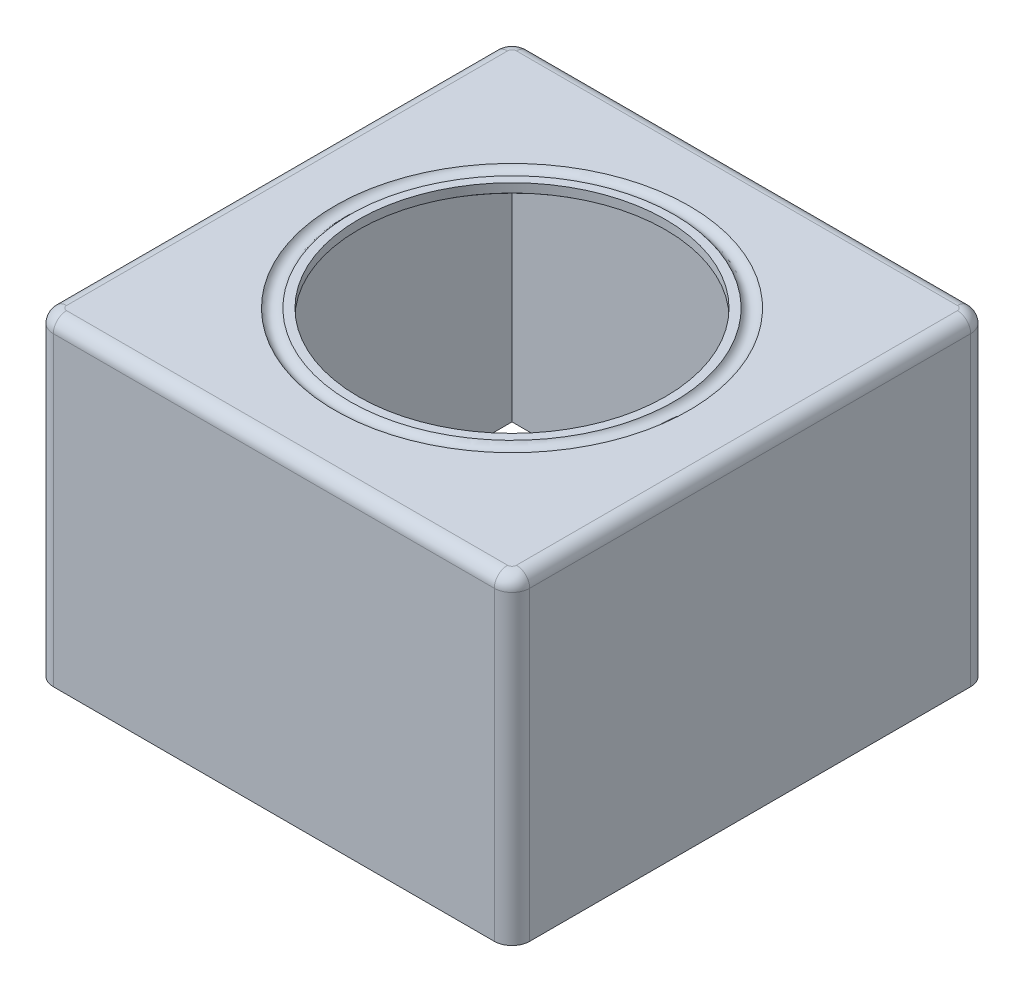
ISO-10303-21;
HEADER;
FILE_DESCRIPTION(('STEP AP214'),'2;1');
FILE_NAME('part.step','',(''),(''),'','','');
FILE_SCHEMA(('AUTOMOTIVE_DESIGN { 1 0 10303 214 1 1 1 1 }'));
ENDSEC;
DATA;
#1=APPLICATION_CONTEXT('core data for automotive mechanical design processes');
#2=APPLICATION_PROTOCOL_DEFINITION('international standard','automotive_design',2000,#1);
#3=PRODUCT_CONTEXT('',#1,'mechanical');
#4=PRODUCT('Part','Part','',(#3));
#5=PRODUCT_RELATED_PRODUCT_CATEGORY('part','',(#4));
#6=PRODUCT_DEFINITION_FORMATION('','',#4);
#7=PRODUCT_DEFINITION_CONTEXT('part definition',#1,'design');
#8=PRODUCT_DEFINITION('design','',#6,#7);
#9=PRODUCT_DEFINITION_SHAPE('','',#8);
#10=(LENGTH_UNIT() NAMED_UNIT(*) SI_UNIT(.MILLI.,.METRE.));
#11=(NAMED_UNIT(*) PLANE_ANGLE_UNIT() SI_UNIT($,.RADIAN.));
#12=(NAMED_UNIT(*) SI_UNIT($,.STERADIAN.) SOLID_ANGLE_UNIT());
#13=UNCERTAINTY_MEASURE_WITH_UNIT(LENGTH_MEASURE(1.E-05),#10,'distance_accuracy_value','');
#14=(GEOMETRIC_REPRESENTATION_CONTEXT(3) GLOBAL_UNCERTAINTY_ASSIGNED_CONTEXT((#13)) GLOBAL_UNIT_ASSIGNED_CONTEXT((#10,
#11,#12)) REPRESENTATION_CONTEXT('',''));
#15=CARTESIAN_POINT('',(0.,0.,0.));
#16=DIRECTION('',(0.,0.,1.));
#17=DIRECTION('',(1.,0.,0.));
#18=AXIS2_PLACEMENT_3D('',#15,#16,#17);
#19=CARTESIAN_POINT('',(-49.751932707483,0.,49.751932707483));
#20=DIRECTION('',(0.,-1.,0.));
#21=DIRECTION('',(0.,0.,-1.));
#22=AXIS2_PLACEMENT_3D('',#19,#20,#21);
#23=PLANE('',#22);
#24=CARTESIAN_POINT('',(-49.751932707483,0.,49.751932707483));
#25=DIRECTION('',(0.,1.,0.));
#26=DIRECTION('',(0.,0.,-1.));
#27=AXIS2_PLACEMENT_3D('',#24,#25,#26);
#28=CIRCLE('',#27,4.);
#29=CARTESIAN_POINT('',(-53.751932707483,0.,49.7519327074829));
#30=VERTEX_POINT('',#29);
#31=CARTESIAN_POINT('',(-49.7519327074829,0.,53.751932707483));
#32=VERTEX_POINT('',#31);
#33=EDGE_CURVE('E186',#30,#32,#28,.T.);
#34=ORIENTED_EDGE('',*,*,#33,.F.);
#35=DIRECTION('',(0.,0.,1.));
#36=VECTOR('',#35,1.);
#37=CARTESIAN_POINT('',(-53.751932707483,0.,49.7519327074829));
#38=LINE('',#37,#36);
#39=CARTESIAN_POINT('',(-53.751932707483,0.,-49.7519327074829));
#40=VERTEX_POINT('',#39);
#41=EDGE_CURVE('E221',#40,#30,#38,.T.);
#42=ORIENTED_EDGE('',*,*,#41,.F.);
#43=CARTESIAN_POINT('',(-49.751932707483,0.,-49.751932707483));
#44=DIRECTION('',(0.,1.,0.));
#45=DIRECTION('',(0.,0.,-1.));
#46=AXIS2_PLACEMENT_3D('',#43,#44,#45);
#47=CIRCLE('',#46,4.);
#48=CARTESIAN_POINT('',(-49.7519327074829,0.,-53.751932707483));
#49=VERTEX_POINT('',#48);
#50=EDGE_CURVE('E217',#49,#40,#47,.T.);
#51=ORIENTED_EDGE('',*,*,#50,.F.);
#52=DIRECTION('',(-1.,0.,0.));
#53=VECTOR('',#52,1.);
#54=CARTESIAN_POINT('',(-49.7519327074829,0.,-53.751932707483));
#55=LINE('',#54,#53);
#56=CARTESIAN_POINT('',(49.7519327074829,0.,-53.751932707483));
#57=VERTEX_POINT('',#56);
#58=EDGE_CURVE('E213',#57,#49,#55,.T.);
#59=ORIENTED_EDGE('',*,*,#58,.F.);
#60=CARTESIAN_POINT('',(49.751932707483,0.,-49.751932707483));
#61=DIRECTION('',(0.,1.,0.));
#62=DIRECTION('',(0.,0.,-1.));
#63=AXIS2_PLACEMENT_3D('',#60,#61,#62);
#64=CIRCLE('',#63,4.);
#65=CARTESIAN_POINT('',(53.751932707483,0.,-49.7519327074829));
#66=VERTEX_POINT('',#65);
#67=EDGE_CURVE('E209',#66,#57,#64,.T.);
#68=ORIENTED_EDGE('',*,*,#67,.F.);
#69=DIRECTION('',(0.,0.,-1.));
#70=VECTOR('',#69,1.);
#71=CARTESIAN_POINT('',(53.751932707483,0.,49.7519327074829));
#72=LINE('',#71,#70);
#73=CARTESIAN_POINT('',(53.751932707483,0.,49.7519327074829));
#74=VERTEX_POINT('',#73);
#75=EDGE_CURVE('E205',#74,#66,#72,.T.);
#76=ORIENTED_EDGE('',*,*,#75,.F.);
#77=CARTESIAN_POINT('',(49.751932707483,0.,49.751932707483));
#78=DIRECTION('',(0.,1.,0.));
#79=DIRECTION('',(0.,0.,1.));
#80=AXIS2_PLACEMENT_3D('',#77,#78,#79);
#81=CIRCLE('',#80,4.);
#82=CARTESIAN_POINT('',(49.7519327074829,0.,53.751932707483));
#83=VERTEX_POINT('',#82);
#84=EDGE_CURVE('E201',#83,#74,#81,.T.);
#85=ORIENTED_EDGE('',*,*,#84,.F.);
#86=DIRECTION('',(1.,0.,0.));
#87=VECTOR('',#86,1.);
#88=CARTESIAN_POINT('',(-49.7519327074829,0.,53.751932707483));
#89=LINE('',#88,#87);
#90=EDGE_CURVE('E192',#32,#83,#89,.T.);
#91=ORIENTED_EDGE('',*,*,#90,.F.);
#92=EDGE_LOOP('',(#34,#42,#51,#59,#68,#76,#85,#91));
#93=FACE_BOUND('',#92,.T.);
#94=DIRECTION('',(-1.,0.,0.));
#95=VECTOR('',#94,1.);
#96=CARTESIAN_POINT('',(-49.751932707483,0.,-49.751932707483));
#97=LINE('',#96,#95);
#98=CARTESIAN_POINT('',(49.751932707483,0.,-49.751932707483));
#99=VERTEX_POINT('',#98);
#100=CARTESIAN_POINT('',(-49.751932707483,0.,-49.751932707483));
#101=VERTEX_POINT('',#100);
#102=EDGE_CURVE('E180',#99,#101,#97,.T.);
#103=ORIENTED_EDGE('',*,*,#102,.T.);
#104=DIRECTION('',(0.,0.,1.));
#105=VECTOR('',#104,1.);
#106=CARTESIAN_POINT('',(-49.751932707483,0.,49.751932707483));
#107=LINE('',#106,#105);
#108=CARTESIAN_POINT('',(-49.751932707483,0.,49.751932707483));
#109=VERTEX_POINT('',#108);
#110=EDGE_CURVE('E325',#101,#109,#107,.T.);
#111=ORIENTED_EDGE('',*,*,#110,.T.);
#112=DIRECTION('',(1.,0.,0.));
#113=VECTOR('',#112,1.);
#114=CARTESIAN_POINT('',(-49.751932707483,0.,49.751932707483));
#115=LINE('',#114,#113);
#116=CARTESIAN_POINT('',(49.751932707483,0.,49.751932707483));
#117=VERTEX_POINT('',#116);
#118=EDGE_CURVE('E184',#109,#117,#115,.T.);
#119=ORIENTED_EDGE('',*,*,#118,.T.);
#120=DIRECTION('',(0.,0.,-1.));
#121=VECTOR('',#120,1.);
#122=CARTESIAN_POINT('',(49.751932707483,0.,49.751932707483));
#123=LINE('',#122,#121);
#124=EDGE_CURVE('E335',#117,#99,#123,.T.);
#125=ORIENTED_EDGE('',*,*,#124,.T.);
#126=EDGE_LOOP('',(#103,#111,#119,#125));
#127=FACE_BOUND('',#126,.T.);
#128=ADVANCED_FACE('F45',(#93,#127),#23,.T.);
#129=CARTESIAN_POINT('',(-49.751932707483,70.,49.751932707483));
#130=DIRECTION('',(0.,-1.,0.));
#131=DIRECTION('',(0.,0.,-1.));
#132=AXIS2_PLACEMENT_3D('',#129,#130,#131);
#133=CYLINDRICAL_SURFACE('',#132,4.);
#134=DIRECTION('',(0.,-1.,0.));
#135=VECTOR('',#134,1.);
#136=CARTESIAN_POINT('',(-49.7519327074829,70.,53.751932707483));
#137=LINE('',#136,#135);
#138=CARTESIAN_POINT('',(-49.7519327074829,69.,53.751932707483));
#139=VERTEX_POINT('',#138);
#140=EDGE_CURVE('E246',#139,#32,#137,.T.);
#141=ORIENTED_EDGE('',*,*,#140,.F.);
#142=CARTESIAN_POINT('',(-49.751932707483,69.,49.751932707483));
#143=DIRECTION('',(0.,1.,0.));
#144=DIRECTION('',(0.,0.,1.));
#145=AXIS2_PLACEMENT_3D('',#142,#143,#144);
#146=CIRCLE('',#145,4.);
#147=CARTESIAN_POINT('',(-53.751932707483,69.,49.7519327074829));
#148=VERTEX_POINT('',#147);
#149=EDGE_CURVE('E281',#139,#148,#146,.F.);
#150=ORIENTED_EDGE('',*,*,#149,.T.);
#151=DIRECTION('',(0.,-1.,0.));
#152=VECTOR('',#151,1.);
#153=CARTESIAN_POINT('',(-53.751932707483,70.,49.7519327074829));
#154=LINE('',#153,#152);
#155=EDGE_CURVE('E225',#148,#30,#154,.T.);
#156=ORIENTED_EDGE('',*,*,#155,.T.);
#157=ORIENTED_EDGE('',*,*,#33,.T.);
#158=EDGE_LOOP('',(#141,#150,#156,#157));
#159=FACE_BOUND('',#158,.T.);
#160=ADVANCED_FACE('F356',(#159),#133,.T.);
#161=CARTESIAN_POINT('',(-49.7519327074829,70.,53.751932707483));
#162=DIRECTION('',(0.,0.,-1.));
#163=DIRECTION('',(-1.,0.,0.));
#164=AXIS2_PLACEMENT_3D('',#161,#162,#163);
#165=PLANE('',#164);
#166=DIRECTION('',(0.,-1.,0.));
#167=VECTOR('',#166,1.);
#168=CARTESIAN_POINT('',(49.7519327074829,70.,53.751932707483));
#169=LINE('',#168,#167);
#170=CARTESIAN_POINT('',(49.7519327074829,69.,53.751932707483));
#171=VERTEX_POINT('',#170);
#172=EDGE_CURVE('E243',#171,#83,#169,.T.);
#173=ORIENTED_EDGE('',*,*,#172,.F.);
#174=DIRECTION('',(1.,0.,0.));
#175=VECTOR('',#174,1.);
#176=CARTESIAN_POINT('',(-49.7519327074829,69.,53.751932707483));
#177=LINE('',#176,#175);
#178=EDGE_CURVE('E278',#171,#139,#177,.F.);
#179=ORIENTED_EDGE('',*,*,#178,.T.);
#180=ORIENTED_EDGE('',*,*,#140,.T.);
#181=ORIENTED_EDGE('',*,*,#90,.T.);
#182=EDGE_LOOP('',(#173,#179,#180,#181));
#183=FACE_BOUND('',#182,.T.);
#184=ADVANCED_FACE('F362',(#183),#165,.F.);
#185=CARTESIAN_POINT('',(49.751932707483,70.,49.751932707483));
#186=DIRECTION('',(0.,-1.,0.));
#187=DIRECTION('',(0.,0.,-1.));
#188=AXIS2_PLACEMENT_3D('',#185,#186,#187);
#189=CYLINDRICAL_SURFACE('',#188,4.);
#190=DIRECTION('',(0.,-1.,0.));
#191=VECTOR('',#190,1.);
#192=CARTESIAN_POINT('',(53.751932707483,70.,49.7519327074829));
#193=LINE('',#192,#191);
#194=CARTESIAN_POINT('',(53.751932707483,69.,49.7519327074829));
#195=VERTEX_POINT('',#194);
#196=EDGE_CURVE('E240',#195,#74,#193,.T.);
#197=ORIENTED_EDGE('',*,*,#196,.F.);
#198=CARTESIAN_POINT('',(49.751932707483,69.,49.751932707483));
#199=DIRECTION('',(0.,1.,0.));
#200=DIRECTION('',(0.,0.,1.));
#201=AXIS2_PLACEMENT_3D('',#198,#199,#200);
#202=CIRCLE('',#201,4.);
#203=EDGE_CURVE('E274',#195,#171,#202,.F.);
#204=ORIENTED_EDGE('',*,*,#203,.T.);
#205=ORIENTED_EDGE('',*,*,#172,.T.);
#206=ORIENTED_EDGE('',*,*,#84,.T.);
#207=EDGE_LOOP('',(#197,#204,#205,#206));
#208=FACE_BOUND('',#207,.T.);
#209=ADVANCED_FACE('F386',(#208),#189,.T.);
#210=CARTESIAN_POINT('',(53.751932707483,70.,49.7519327074829));
#211=DIRECTION('',(-1.,0.,0.));
#212=DIRECTION('',(0.,0.,1.));
#213=AXIS2_PLACEMENT_3D('',#210,#211,#212);
#214=PLANE('',#213);
#215=DIRECTION('',(0.,-1.,0.));
#216=VECTOR('',#215,1.);
#217=CARTESIAN_POINT('',(53.751932707483,70.,-49.7519327074829));
#218=LINE('',#217,#216);
#219=CARTESIAN_POINT('',(53.751932707483,69.,-49.7519327074829));
#220=VERTEX_POINT('',#219);
#221=EDGE_CURVE('E237',#220,#66,#218,.T.);
#222=ORIENTED_EDGE('',*,*,#221,.F.);
#223=DIRECTION('',(0.,0.,-1.));
#224=VECTOR('',#223,1.);
#225=CARTESIAN_POINT('',(53.751932707483,69.,49.7519327074829));
#226=LINE('',#225,#224);
#227=EDGE_CURVE('E54',#220,#195,#226,.F.);
#228=ORIENTED_EDGE('',*,*,#227,.T.);
#229=ORIENTED_EDGE('',*,*,#196,.T.);
#230=ORIENTED_EDGE('',*,*,#75,.T.);
#231=EDGE_LOOP('',(#222,#228,#229,#230));
#232=FACE_BOUND('',#231,.T.);
#233=ADVANCED_FACE('F383',(#232),#214,.F.);
#234=CARTESIAN_POINT('',(49.751932707483,70.,-49.751932707483));
#235=DIRECTION('',(0.,-1.,0.));
#236=DIRECTION('',(0.,0.,-1.));
#237=AXIS2_PLACEMENT_3D('',#234,#235,#236);
#238=CYLINDRICAL_SURFACE('',#237,4.);
#239=DIRECTION('',(0.,-1.,0.));
#240=VECTOR('',#239,1.);
#241=CARTESIAN_POINT('',(49.7519327074829,70.,-53.751932707483));
#242=LINE('',#241,#240);
#243=CARTESIAN_POINT('',(49.7519327074829,69.,-53.751932707483));
#244=VERTEX_POINT('',#243);
#245=EDGE_CURVE('E234',#244,#57,#242,.T.);
#246=ORIENTED_EDGE('',*,*,#245,.F.);
#247=CARTESIAN_POINT('',(49.751932707483,69.,-49.751932707483));
#248=DIRECTION('',(0.,1.,0.));
#249=DIRECTION('',(0.,0.,1.));
#250=AXIS2_PLACEMENT_3D('',#247,#248,#249);
#251=CIRCLE('',#250,4.);
#252=EDGE_CURVE('E61',#244,#220,#251,.F.);
#253=ORIENTED_EDGE('',*,*,#252,.T.);
#254=ORIENTED_EDGE('',*,*,#221,.T.);
#255=ORIENTED_EDGE('',*,*,#67,.T.);
#256=EDGE_LOOP('',(#246,#253,#254,#255));
#257=FACE_BOUND('',#256,.T.);
#258=ADVANCED_FACE('F380',(#257),#238,.T.);
#259=CARTESIAN_POINT('',(-49.7519327074829,70.,-53.751932707483));
#260=DIRECTION('',(0.,0.,1.));
#261=DIRECTION('',(1.,0.,0.));
#262=AXIS2_PLACEMENT_3D('',#259,#260,#261);
#263=PLANE('',#262);
#264=DIRECTION('',(0.,-1.,0.));
#265=VECTOR('',#264,1.);
#266=CARTESIAN_POINT('',(-49.7519327074829,70.,-53.751932707483));
#267=LINE('',#266,#265);
#268=CARTESIAN_POINT('',(-49.7519327074829,69.,-53.751932707483));
#269=VERTEX_POINT('',#268);
#270=EDGE_CURVE('E231',#269,#49,#267,.T.);
#271=ORIENTED_EDGE('',*,*,#270,.F.);
#272=DIRECTION('',(-1.,0.,0.));
#273=VECTOR('',#272,1.);
#274=CARTESIAN_POINT('',(49.7519327074829,69.,-53.751932707483));
#275=LINE('',#274,#273);
#276=EDGE_CURVE('E69',#269,#244,#275,.F.);
#277=ORIENTED_EDGE('',*,*,#276,.T.);
#278=ORIENTED_EDGE('',*,*,#245,.T.);
#279=ORIENTED_EDGE('',*,*,#58,.T.);
#280=EDGE_LOOP('',(#271,#277,#278,#279));
#281=FACE_BOUND('',#280,.T.);
#282=ADVANCED_FACE('F376',(#281),#263,.F.);
#283=CARTESIAN_POINT('',(-49.751932707483,70.,-49.751932707483));
#284=DIRECTION('',(0.,-1.,0.));
#285=DIRECTION('',(0.,0.,-1.));
#286=AXIS2_PLACEMENT_3D('',#283,#284,#285);
#287=CYLINDRICAL_SURFACE('',#286,4.);
#288=DIRECTION('',(0.,-1.,0.));
#289=VECTOR('',#288,1.);
#290=CARTESIAN_POINT('',(-53.751932707483,70.,-49.7519327074829));
#291=LINE('',#290,#289);
#292=CARTESIAN_POINT('',(-53.751932707483,69.,-49.7519327074829));
#293=VERTEX_POINT('',#292);
#294=EDGE_CURVE('E228',#293,#40,#291,.T.);
#295=ORIENTED_EDGE('',*,*,#294,.F.);
#296=CARTESIAN_POINT('',(-49.751932707483,69.,-49.751932707483));
#297=DIRECTION('',(0.,1.,0.));
#298=DIRECTION('',(0.,0.,1.));
#299=AXIS2_PLACEMENT_3D('',#296,#297,#298);
#300=CIRCLE('',#299,4.);
#301=EDGE_CURVE('E287',#293,#269,#300,.F.);
#302=ORIENTED_EDGE('',*,*,#301,.T.);
#303=ORIENTED_EDGE('',*,*,#270,.T.);
#304=ORIENTED_EDGE('',*,*,#50,.T.);
#305=EDGE_LOOP('',(#295,#302,#303,#304));
#306=FACE_BOUND('',#305,.T.);
#307=ADVANCED_FACE('F372',(#306),#287,.T.);
#308=CARTESIAN_POINT('',(-53.751932707483,70.,49.7519327074829));
#309=DIRECTION('',(1.,0.,0.));
#310=DIRECTION('',(0.,0.,-1.));
#311=AXIS2_PLACEMENT_3D('',#308,#309,#310);
#312=PLANE('',#311);
#313=ORIENTED_EDGE('',*,*,#155,.F.);
#314=DIRECTION('',(0.,0.,1.));
#315=VECTOR('',#314,1.);
#316=CARTESIAN_POINT('',(-53.751932707483,69.,-49.7519327074829));
#317=LINE('',#316,#315);
#318=EDGE_CURVE('E284',#148,#293,#317,.F.);
#319=ORIENTED_EDGE('',*,*,#318,.T.);
#320=ORIENTED_EDGE('',*,*,#294,.T.);
#321=ORIENTED_EDGE('',*,*,#41,.T.);
#322=EDGE_LOOP('',(#313,#319,#320,#321));
#323=FACE_BOUND('',#322,.T.);
#324=ADVANCED_FACE('F369',(#323),#312,.F.);
#325=CARTESIAN_POINT('',(-49.751932707483,70.,49.751932707483));
#326=DIRECTION('',(1.,0.,0.));
#327=DIRECTION('',(0.,0.,-1.));
#328=AXIS2_PLACEMENT_3D('',#325,#326,#327);
#329=PLANE('',#328);
#330=ORIENTED_EDGE('',*,*,#110,.F.);
#331=DIRECTION('',(0.,-1.,0.));
#332=VECTOR('',#331,1.);
#333=CARTESIAN_POINT('',(-49.751932707483,70.,-49.751932707483));
#334=LINE('',#333,#332);
#335=CARTESIAN_POINT('',(-49.751932707483,70.,-49.751932707483));
#336=VERTEX_POINT('',#335);
#337=EDGE_CURVE('E178',#336,#101,#334,.T.);
#338=ORIENTED_EDGE('',*,*,#337,.F.);
#339=DIRECTION('',(0.,0.,1.));
#340=VECTOR('',#339,1.);
#341=CARTESIAN_POINT('',(-49.751932707483,70.,49.751932707483));
#342=LINE('',#341,#340);
#343=CARTESIAN_POINT('',(-49.751932707483,70.,49.751932707483));
#344=VERTEX_POINT('',#343);
#345=EDGE_CURVE('E162',#336,#344,#342,.T.);
#346=ORIENTED_EDGE('',*,*,#345,.T.);
#347=DIRECTION('',(0.,-1.,0.));
#348=VECTOR('',#347,1.);
#349=CARTESIAN_POINT('',(-49.751932707483,70.,49.751932707483));
#350=LINE('',#349,#348);
#351=EDGE_CURVE('E175',#344,#109,#350,.T.);
#352=ORIENTED_EDGE('',*,*,#351,.T.);
#353=EDGE_LOOP('',(#330,#338,#346,#352));
#354=FACE_BOUND('',#353,.T.);
#355=ADVANCED_FACE('F174',(#354),#329,.T.);
#356=CARTESIAN_POINT('',(-49.751932707483,70.,49.751932707483));
#357=DIRECTION('',(0.,0.,-1.));
#358=DIRECTION('',(-1.,0.,0.));
#359=AXIS2_PLACEMENT_3D('',#356,#357,#358);
#360=PLANE('',#359);
#361=ORIENTED_EDGE('',*,*,#118,.F.);
#362=ORIENTED_EDGE('',*,*,#351,.F.);
#363=DIRECTION('',(1.,0.,0.));
#364=VECTOR('',#363,1.);
#365=CARTESIAN_POINT('',(-49.751932707483,70.,49.751932707483));
#366=LINE('',#365,#364);
#367=CARTESIAN_POINT('',(49.751932707483,70.,49.751932707483));
#368=VERTEX_POINT('',#367);
#369=EDGE_CURVE('E159',#344,#368,#366,.T.);
#370=ORIENTED_EDGE('',*,*,#369,.T.);
#371=DIRECTION('',(0.,-1.,0.));
#372=VECTOR('',#371,1.);
#373=CARTESIAN_POINT('',(49.751932707483,70.,49.751932707483));
#374=LINE('',#373,#372);
#375=EDGE_CURVE('E187',#368,#117,#374,.T.);
#376=ORIENTED_EDGE('',*,*,#375,.T.);
#377=EDGE_LOOP('',(#361,#362,#370,#376));
#378=FACE_BOUND('',#377,.T.);
#379=ADVANCED_FACE('F182',(#378),#360,.T.);
#380=CARTESIAN_POINT('',(49.751932707483,70.,49.751932707483));
#381=DIRECTION('',(-1.,0.,0.));
#382=DIRECTION('',(0.,0.,1.));
#383=AXIS2_PLACEMENT_3D('',#380,#381,#382);
#384=PLANE('',#383);
#385=ORIENTED_EDGE('',*,*,#124,.F.);
#386=ORIENTED_EDGE('',*,*,#375,.F.);
#387=DIRECTION('',(0.,0.,-1.));
#388=VECTOR('',#387,1.);
#389=CARTESIAN_POINT('',(49.751932707483,70.,49.751932707483));
#390=LINE('',#389,#388);
#391=CARTESIAN_POINT('',(49.751932707483,70.,-49.751932707483));
#392=VERTEX_POINT('',#391);
#393=EDGE_CURVE('E165',#368,#392,#390,.T.);
#394=ORIENTED_EDGE('',*,*,#393,.T.);
#395=DIRECTION('',(0.,-1.,0.));
#396=VECTOR('',#395,1.);
#397=CARTESIAN_POINT('',(49.751932707483,70.,-49.751932707483));
#398=LINE('',#397,#396);
#399=EDGE_CURVE('E194',#392,#99,#398,.T.);
#400=ORIENTED_EDGE('',*,*,#399,.T.);
#401=EDGE_LOOP('',(#385,#386,#394,#400));
#402=FACE_BOUND('',#401,.T.);
#403=ADVANCED_FACE('F352',(#402),#384,.T.);
#404=CARTESIAN_POINT('',(-49.751932707483,70.,-49.751932707483));
#405=DIRECTION('',(0.,0.,1.));
#406=DIRECTION('',(1.,0.,0.));
#407=AXIS2_PLACEMENT_3D('',#404,#405,#406);
#408=PLANE('',#407);
#409=ORIENTED_EDGE('',*,*,#102,.F.);
#410=ORIENTED_EDGE('',*,*,#399,.F.);
#411=DIRECTION('',(-1.,0.,0.));
#412=VECTOR('',#411,1.);
#413=CARTESIAN_POINT('',(-49.751932707483,70.,-49.751932707483));
#414=LINE('',#413,#412);
#415=EDGE_CURVE('E338',#392,#336,#414,.T.);
#416=ORIENTED_EDGE('',*,*,#415,.T.);
#417=ORIENTED_EDGE('',*,*,#337,.T.);
#418=EDGE_LOOP('',(#409,#410,#416,#417));
#419=FACE_BOUND('',#418,.T.);
#420=ADVANCED_FACE('F354',(#419),#408,.T.);
#421=CARTESIAN_POINT('',(0.,72.,0.));
#422=DIRECTION('',(0.,1.,0.));
#423=DIRECTION('',(0.,0.,1.));
#424=AXIS2_PLACEMENT_3D('',#421,#422,#423);
#425=PLANE('',#424);
#426=DIRECTION('',(1.,0.,0.));
#427=VECTOR('',#426,1.);
#428=CARTESIAN_POINT('',(49.751932707483,72.,50.751932707483));
#429=LINE('',#428,#427);
#430=CARTESIAN_POINT('',(-49.7519327074829,72.,50.751932707483));
#431=VERTEX_POINT('',#430);
#432=CARTESIAN_POINT('',(49.751932707483,72.,50.751932707483));
#433=VERTEX_POINT('',#432);
#434=EDGE_CURVE('E267',#431,#433,#429,.T.);
#435=ORIENTED_EDGE('',*,*,#434,.T.);
#436=CARTESIAN_POINT('',(49.751932707483,72.,49.751932707483));
#437=DIRECTION('',(0.,1.,0.));
#438=DIRECTION('',(0.,0.,1.));
#439=AXIS2_PLACEMENT_3D('',#436,#437,#438);
#440=CIRCLE('',#439,0.999999999999997);
#441=CARTESIAN_POINT('',(50.751932707483,72.,49.751932707483));
#442=VERTEX_POINT('',#441);
#443=EDGE_CURVE('E270',#433,#442,#440,.T.);
#444=ORIENTED_EDGE('',*,*,#443,.T.);
#445=DIRECTION('',(0.,0.,-1.));
#446=VECTOR('',#445,1.);
#447=CARTESIAN_POINT('',(50.751932707483,72.,-49.7519327074829));
#448=LINE('',#447,#446);
#449=CARTESIAN_POINT('',(50.751932707483,72.,-49.751932707483));
#450=VERTEX_POINT('',#449);
#451=EDGE_CURVE('E249',#442,#450,#448,.T.);
#452=ORIENTED_EDGE('',*,*,#451,.T.);
#453=CARTESIAN_POINT('',(49.751932707483,72.,-49.751932707483));
#454=DIRECTION('',(0.,1.,0.));
#455=DIRECTION('',(0.,0.,1.));
#456=AXIS2_PLACEMENT_3D('',#453,#454,#455);
#457=CIRCLE('',#456,0.999999999999997);
#458=CARTESIAN_POINT('',(49.7519327074829,72.,-50.751932707483));
#459=VERTEX_POINT('',#458);
#460=EDGE_CURVE('E252',#450,#459,#457,.T.);
#461=ORIENTED_EDGE('',*,*,#460,.T.);
#462=DIRECTION('',(-1.,0.,0.));
#463=VECTOR('',#462,1.);
#464=CARTESIAN_POINT('',(-49.7519327074829,72.,-50.751932707483));
#465=LINE('',#464,#463);
#466=CARTESIAN_POINT('',(-49.751932707483,72.,-50.751932707483));
#467=VERTEX_POINT('',#466);
#468=EDGE_CURVE('E255',#459,#467,#465,.T.);
#469=ORIENTED_EDGE('',*,*,#468,.T.);
#470=CARTESIAN_POINT('',(-49.751932707483,72.,-49.751932707483));
#471=DIRECTION('',(0.,1.,0.));
#472=DIRECTION('',(0.,0.,1.));
#473=AXIS2_PLACEMENT_3D('',#470,#471,#472);
#474=CIRCLE('',#473,0.999999999999997);
#475=CARTESIAN_POINT('',(-50.751932707483,72.,-49.7519327074829));
#476=VERTEX_POINT('',#475);
#477=EDGE_CURVE('E258',#467,#476,#474,.T.);
#478=ORIENTED_EDGE('',*,*,#477,.T.);
#479=DIRECTION('',(0.,0.,1.));
#480=VECTOR('',#479,1.);
#481=CARTESIAN_POINT('',(-50.751932707483,72.,49.7519327074829));
#482=LINE('',#481,#480);
#483=CARTESIAN_POINT('',(-50.751932707483,72.,49.751932707483));
#484=VERTEX_POINT('',#483);
#485=EDGE_CURVE('E261',#476,#484,#482,.T.);
#486=ORIENTED_EDGE('',*,*,#485,.T.);
#487=CARTESIAN_POINT('',(-49.751932707483,72.,49.751932707483));
#488=DIRECTION('',(0.,1.,0.));
#489=DIRECTION('',(0.,0.,1.));
#490=AXIS2_PLACEMENT_3D('',#487,#488,#489);
#491=CIRCLE('',#490,0.999999999999997);
#492=EDGE_CURVE('E264',#484,#431,#491,.T.);
#493=ORIENTED_EDGE('',*,*,#492,.T.);
#494=EDGE_LOOP('',(#435,#444,#452,#461,#469,#478,#486,#493));
#495=FACE_BOUND('',#494,.T.);
#496=CARTESIAN_POINT('',(0.,72.,0.));
#497=DIRECTION('',(0.,-1.,0.));
#498=DIRECTION('',(0.,0.,-1.));
#499=AXIS2_PLACEMENT_3D('',#496,#497,#498);
#500=CIRCLE('',#499,39.9779267923513);
#501=CARTESIAN_POINT('',(0.,72.,-39.9779267923513));
#502=VERTEX_POINT('',#501);
#503=EDGE_CURVE('E467',#502,#502,#500,.T.);
#504=ORIENTED_EDGE('',*,*,#503,.T.);
#505=EDGE_LOOP('',(#504));
#506=FACE_BOUND('',#505,.T.);
#507=ADVANCED_FACE('F427',(#495,#506),#425,.T.);
#508=CARTESIAN_POINT('',(0.,70.,0.));
#509=DIRECTION('',(0.,1.,0.));
#510=DIRECTION('',(0.,0.,1.));
#511=AXIS2_PLACEMENT_3D('',#508,#509,#510);
#512=PLANE('',#511);
#513=CARTESIAN_POINT('',(0.,70.,0.));
#514=DIRECTION('',(0.,1.,0.));
#515=DIRECTION('',(0.,0.,1.));
#516=AXIS2_PLACEMENT_3D('',#513,#514,#515);
#517=CIRCLE('',#516,41.9062821272601);
#518=CARTESIAN_POINT('',(0.,70.,41.9062821272601));
#519=VERTEX_POINT('',#518);
#520=EDGE_CURVE('E11',#519,#519,#517,.F.);
#521=ORIENTED_EDGE('',*,*,#520,.F.);
#522=EDGE_LOOP('',(#521));
#523=FACE_BOUND('',#522,.T.);
#524=ORIENTED_EDGE('',*,*,#345,.F.);
#525=ORIENTED_EDGE('',*,*,#415,.F.);
#526=ORIENTED_EDGE('',*,*,#393,.F.);
#527=ORIENTED_EDGE('',*,*,#369,.F.);
#528=EDGE_LOOP('',(#524,#525,#526,#527));
#529=FACE_BOUND('',#528,.T.);
#530=ADVANCED_FACE('F161',(#523,#529),#512,.F.);
#531=CARTESIAN_POINT('',(-49.751932707483,69.,-49.751932707483));
#532=DIRECTION('',(0.,1.,0.));
#533=DIRECTION('',(0.,0.,1.));
#534=AXIS2_PLACEMENT_3D('',#531,#532,#533);
#535=DEGENERATE_TOROIDAL_SURFACE('',#534,0.999999999999997,3.,.T.);
#536=CARTESIAN_POINT('',(-49.751932707483,69.,-50.751932707483));
#537=DIRECTION('',(1.,0.,0.));
#538=DIRECTION('',(0.,0.,-1.));
#539=AXIS2_PLACEMENT_3D('',#536,#537,#538);
#540=CIRCLE('',#539,3.);
#541=EDGE_CURVE('E319',#269,#467,#540,.T.);
#542=ORIENTED_EDGE('',*,*,#541,.F.);
#543=ORIENTED_EDGE('',*,*,#301,.F.);
#544=CARTESIAN_POINT('',(-50.751932707483,69.,-49.7519327074829));
#545=DIRECTION('',(0.,0.,1.));
#546=DIRECTION('',(1.,0.,0.));
#547=AXIS2_PLACEMENT_3D('',#544,#545,#546);
#548=CIRCLE('',#547,3.);
#549=EDGE_CURVE('E322',#476,#293,#548,.T.);
#550=ORIENTED_EDGE('',*,*,#549,.F.);
#551=ORIENTED_EDGE('',*,*,#477,.F.);
#552=EDGE_LOOP('',(#542,#543,#550,#551));
#553=FACE_BOUND('',#552,.T.);
#554=ADVANCED_FACE('F47',(#553),#535,.T.);
#555=CARTESIAN_POINT('',(-50.751932707483,69.,0.));
#556=DIRECTION('',(0.,0.,-1.));
#557=DIRECTION('',(-1.,0.,0.));
#558=AXIS2_PLACEMENT_3D('',#555,#556,#557);
#559=CYLINDRICAL_SURFACE('',#558,3.);
#560=ORIENTED_EDGE('',*,*,#549,.T.);
#561=ORIENTED_EDGE('',*,*,#318,.F.);
#562=CARTESIAN_POINT('',(-50.751932707483,69.,49.751932707483));
#563=DIRECTION('',(0.,0.,1.));
#564=DIRECTION('',(1.,0.,0.));
#565=AXIS2_PLACEMENT_3D('',#562,#563,#564);
#566=CIRCLE('',#565,3.);
#567=EDGE_CURVE('E315',#484,#148,#566,.T.);
#568=ORIENTED_EDGE('',*,*,#567,.F.);
#569=ORIENTED_EDGE('',*,*,#485,.F.);
#570=EDGE_LOOP('',(#560,#561,#568,#569));
#571=FACE_BOUND('',#570,.T.);
#572=ADVANCED_FACE('F417',(#571),#559,.T.);
#573=CARTESIAN_POINT('',(0.,69.,-50.751932707483));
#574=DIRECTION('',(1.,0.,0.));
#575=DIRECTION('',(0.,0.,-1.));
#576=AXIS2_PLACEMENT_3D('',#573,#574,#575);
#577=CYLINDRICAL_SURFACE('',#576,3.);
#578=ORIENTED_EDGE('',*,*,#541,.T.);
#579=ORIENTED_EDGE('',*,*,#468,.F.);
#580=CARTESIAN_POINT('',(49.7519327074829,69.,-50.751932707483));
#581=DIRECTION('',(1.,0.,0.));
#582=DIRECTION('',(0.,0.,-1.));
#583=AXIS2_PLACEMENT_3D('',#580,#581,#582);
#584=CIRCLE('',#583,3.);
#585=EDGE_CURVE('E311',#244,#459,#584,.T.);
#586=ORIENTED_EDGE('',*,*,#585,.F.);
#587=ORIENTED_EDGE('',*,*,#276,.F.);
#588=EDGE_LOOP('',(#578,#579,#586,#587));
#589=FACE_BOUND('',#588,.T.);
#590=ADVANCED_FACE('F414',(#589),#577,.T.);
#591=CARTESIAN_POINT('',(-49.751932707483,69.,49.751932707483));
#592=DIRECTION('',(0.,1.,0.));
#593=DIRECTION('',(0.,0.,1.));
#594=AXIS2_PLACEMENT_3D('',#591,#592,#593);
#595=DEGENERATE_TOROIDAL_SURFACE('',#594,0.999999999999997,3.,.T.);
#596=ORIENTED_EDGE('',*,*,#567,.T.);
#597=ORIENTED_EDGE('',*,*,#149,.F.);
#598=CARTESIAN_POINT('',(-49.7519327074829,69.,50.751932707483));
#599=DIRECTION('',(1.,0.,0.));
#600=DIRECTION('',(0.,0.,-1.));
#601=AXIS2_PLACEMENT_3D('',#598,#599,#600);
#602=CIRCLE('',#601,3.);
#603=EDGE_CURVE('E307',#431,#139,#602,.T.);
#604=ORIENTED_EDGE('',*,*,#603,.F.);
#605=ORIENTED_EDGE('',*,*,#492,.F.);
#606=EDGE_LOOP('',(#596,#597,#604,#605));
#607=FACE_BOUND('',#606,.T.);
#608=ADVANCED_FACE('F410',(#607),#595,.T.);
#609=CARTESIAN_POINT('',(49.751932707483,69.,-49.751932707483));
#610=DIRECTION('',(0.,1.,0.));
#611=DIRECTION('',(0.,0.,1.));
#612=AXIS2_PLACEMENT_3D('',#609,#610,#611);
#613=DEGENERATE_TOROIDAL_SURFACE('',#612,0.999999999999997,3.,.T.);
#614=ORIENTED_EDGE('',*,*,#585,.T.);
#615=ORIENTED_EDGE('',*,*,#460,.F.);
#616=CARTESIAN_POINT('',(50.751932707483,69.,-49.751932707483));
#617=DIRECTION('',(0.,0.,1.));
#618=DIRECTION('',(1.,0.,0.));
#619=AXIS2_PLACEMENT_3D('',#616,#617,#618);
#620=CIRCLE('',#619,3.);
#621=EDGE_CURVE('E303',#220,#450,#620,.T.);
#622=ORIENTED_EDGE('',*,*,#621,.F.);
#623=ORIENTED_EDGE('',*,*,#252,.F.);
#624=EDGE_LOOP('',(#614,#615,#622,#623));
#625=FACE_BOUND('',#624,.T.);
#626=ADVANCED_FACE('F406',(#625),#613,.T.);
#627=CARTESIAN_POINT('',(0.,69.,50.751932707483));
#628=DIRECTION('',(-1.,0.,0.));
#629=DIRECTION('',(0.,0.,1.));
#630=AXIS2_PLACEMENT_3D('',#627,#628,#629);
#631=CYLINDRICAL_SURFACE('',#630,3.);
#632=ORIENTED_EDGE('',*,*,#603,.T.);
#633=ORIENTED_EDGE('',*,*,#178,.F.);
#634=CARTESIAN_POINT('',(49.751932707483,69.,50.751932707483));
#635=DIRECTION('',(1.,0.,0.));
#636=DIRECTION('',(0.,0.,-1.));
#637=AXIS2_PLACEMENT_3D('',#634,#635,#636);
#638=CIRCLE('',#637,3.);
#639=EDGE_CURVE('E299',#433,#171,#638,.T.);
#640=ORIENTED_EDGE('',*,*,#639,.F.);
#641=ORIENTED_EDGE('',*,*,#434,.F.);
#642=EDGE_LOOP('',(#632,#633,#640,#641));
#643=FACE_BOUND('',#642,.T.);
#644=ADVANCED_FACE('F402',(#643),#631,.T.);
#645=CARTESIAN_POINT('',(50.751932707483,69.,0.));
#646=DIRECTION('',(0.,0.,1.));
#647=DIRECTION('',(1.,0.,0.));
#648=AXIS2_PLACEMENT_3D('',#645,#646,#647);
#649=CYLINDRICAL_SURFACE('',#648,3.);
#650=ORIENTED_EDGE('',*,*,#621,.T.);
#651=ORIENTED_EDGE('',*,*,#451,.F.);
#652=CARTESIAN_POINT('',(50.751932707483,69.,49.7519327074829));
#653=DIRECTION('',(0.,0.,1.));
#654=DIRECTION('',(0.,-1.,0.));
#655=AXIS2_PLACEMENT_3D('',#652,#653,#654);
#656=CIRCLE('',#655,3.);
#657=EDGE_CURVE('E296',#195,#442,#656,.T.);
#658=ORIENTED_EDGE('',*,*,#657,.F.);
#659=ORIENTED_EDGE('',*,*,#227,.F.);
#660=EDGE_LOOP('',(#650,#651,#658,#659));
#661=FACE_BOUND('',#660,.T.);
#662=ADVANCED_FACE('F398',(#661),#649,.T.);
#663=CARTESIAN_POINT('',(49.751932707483,69.,49.751932707483));
#664=DIRECTION('',(0.,1.,0.));
#665=DIRECTION('',(0.,0.,1.));
#666=AXIS2_PLACEMENT_3D('',#663,#664,#665);
#667=DEGENERATE_TOROIDAL_SURFACE('',#666,0.999999999999997,3.,.T.);
#668=ORIENTED_EDGE('',*,*,#639,.T.);
#669=ORIENTED_EDGE('',*,*,#203,.F.);
#670=ORIENTED_EDGE('',*,*,#657,.T.);
#671=ORIENTED_EDGE('',*,*,#443,.F.);
#672=EDGE_LOOP('',(#668,#669,#670,#671));
#673=FACE_BOUND('',#672,.T.);
#674=ADVANCED_FACE('F394',(#673),#667,.T.);
#675=CARTESIAN_POINT('',(0.,74.2066457982881,0.));
#676=DIRECTION('',(0.,-1.,0.));
#677=DIRECTION('',(0.,0.,-1.));
#678=AXIS2_PLACEMENT_3D('',#675,#676,#677);
#679=TOROIDAL_SURFACE('',#678,38.2688444694406,5.56118886451257);
#680=CARTESIAN_POINT('',(0.,70.,0.));
#681=DIRECTION('',(0.,-1.,0.));
#682=DIRECTION('',(0.,0.,-1.));
#683=AXIS2_PLACEMENT_3D('',#680,#681,#682);
#684=CIRCLE('',#683,34.631406811621);
#685=CARTESIAN_POINT('',(0.,70.,-34.631406811621));
#686=VERTEX_POINT('',#685);
#687=EDGE_CURVE('E300',#686,#686,#684,.T.);
#688=ORIENTED_EDGE('',*,*,#687,.F.);
#689=EDGE_LOOP('',(#688));
#690=FACE_BOUND('',#689,.T.);
#691=ORIENTED_EDGE('',*,*,#520,.T.);
#692=EDGE_LOOP('',(#691));
#693=FACE_BOUND('',#692,.T.);
#694=ADVANCED_FACE('F397',(#690,#693),#679,.T.);
#695=CARTESIAN_POINT('',(0.,0.,0.));
#696=DIRECTION('',(0.,-1.,0.));
#697=DIRECTION('',(0.,0.,-1.));
#698=AXIS2_PLACEMENT_3D('',#695,#696,#697);
#699=CYLINDRICAL_SURFACE('',#698,34.631406811621);
#700=CARTESIAN_POINT('',(0.,72.,0.));
#701=DIRECTION('',(0.,-1.,0.));
#702=DIRECTION('',(0.,0.,-1.));
#703=AXIS2_PLACEMENT_3D('',#700,#701,#702);
#704=CIRCLE('',#703,34.631406811621);
#705=CARTESIAN_POINT('',(0.,72.,-34.631406811621));
#706=VERTEX_POINT('',#705);
#707=EDGE_CURVE('E474',#706,#706,#704,.T.);
#708=ORIENTED_EDGE('',*,*,#707,.F.);
#709=EDGE_LOOP('',(#708));
#710=FACE_BOUND('',#709,.T.);
#711=ORIENTED_EDGE('',*,*,#687,.T.);
#712=EDGE_LOOP('',(#711));
#713=FACE_BOUND('',#712,.T.);
#714=ADVANCED_FACE('F486',(#710,#713),#699,.F.);
#715=CARTESIAN_POINT('',(0.,72.,36.5597621465298));
#716=DIRECTION('',(0.,-1.,0.));
#717=DIRECTION('',(0.,0.,-1.));
#718=AXIS2_PLACEMENT_3D('',#715,#716,#717);
#719=PLANE('',#718);
#720=CARTESIAN_POINT('',(0.,72.,0.));
#721=DIRECTION('',(0.,-1.,0.));
#722=DIRECTION('',(0.,0.,-1.));
#723=AXIS2_PLACEMENT_3D('',#720,#721,#722);
#724=CIRCLE('',#723,36.5597621465298);
#725=CARTESIAN_POINT('',(0.,72.,-36.5597621465298));
#726=VERTEX_POINT('',#725);
#727=EDGE_CURVE('E470',#726,#726,#724,.T.);
#728=ORIENTED_EDGE('',*,*,#727,.F.);
#729=EDGE_LOOP('',(#728));
#730=FACE_BOUND('',#729,.T.);
#731=ORIENTED_EDGE('',*,*,#707,.T.);
#732=EDGE_LOOP('',(#731));
#733=FACE_BOUND('',#732,.T.);
#734=ADVANCED_FACE('F495',(#730,#733),#719,.F.);
#735=CARTESIAN_POINT('',(0.,72.9882121626004,0.));
#736=DIRECTION('',(0.,-1.,0.));
#737=DIRECTION('',(0.,0.,-1.));
#738=AXIS2_PLACEMENT_3D('',#735,#736,#737);
#739=TOROIDAL_SURFACE('',#738,38.2688444694406,1.97421520225063);
#740=ORIENTED_EDGE('',*,*,#503,.F.);
#741=EDGE_LOOP('',(#740));
#742=FACE_BOUND('',#741,.T.);
#743=ORIENTED_EDGE('',*,*,#727,.T.);
#744=EDGE_LOOP('',(#743));
#745=FACE_BOUND('',#744,.T.);
#746=ADVANCED_FACE('F742',(#742,#745),#739,.F.);
#747=CLOSED_SHELL('',(#128,#160,#184,#209,#233,#258,#282,#307,#324,#355,#379,#403,#420,#507,
#530,#554,#572,#590,#608,#626,#644,#662,#674,#694,#714,#734,#746));
#748=MANIFOLD_SOLID_BREP('B2',#747);
#749=ADVANCED_BREP_SHAPE_REPRESENTATION('',(#18,#748),#14);
#750=SHAPE_DEFINITION_REPRESENTATION(#9,#749);
ENDSEC;
END-ISO-10303-21;
